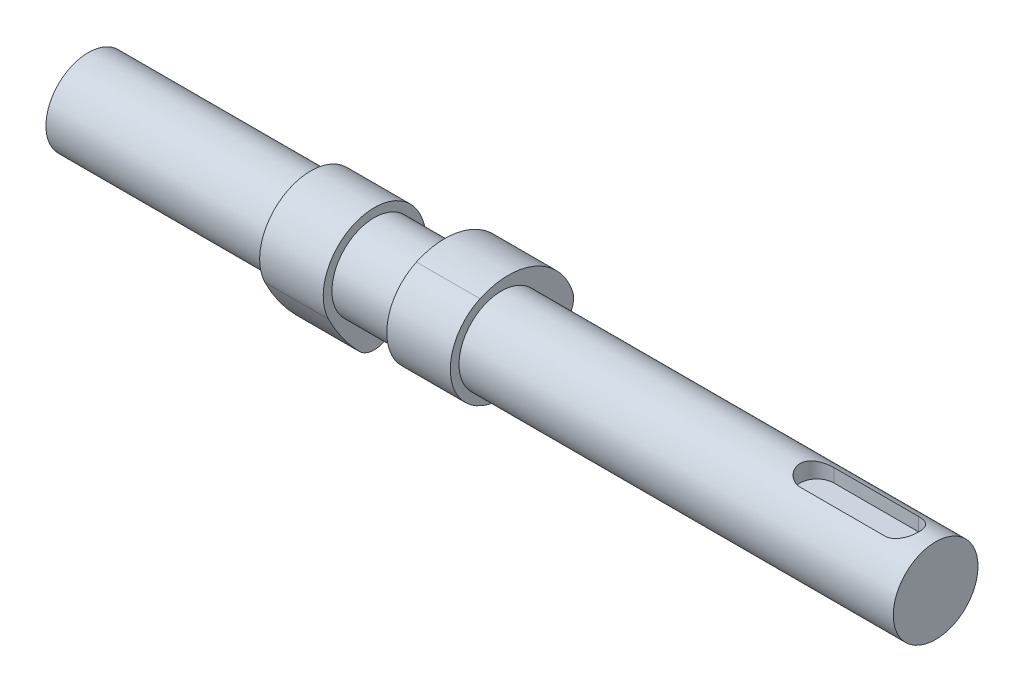
ISO-10303-21;
HEADER;
FILE_DESCRIPTION(('STEP AP214'),'2;1');
FILE_NAME('part.step','',(''),(''),'','','');
FILE_SCHEMA(('AUTOMOTIVE_DESIGN { 1 0 10303 214 1 1 1 1 }'));
ENDSEC;
DATA;
#1=APPLICATION_CONTEXT('core data for automotive mechanical design processes');
#2=APPLICATION_PROTOCOL_DEFINITION('international standard','automotive_design',2000,#1);
#3=PRODUCT_CONTEXT('',#1,'mechanical');
#4=PRODUCT('Part','Part','',(#3));
#5=PRODUCT_RELATED_PRODUCT_CATEGORY('part','',(#4));
#6=PRODUCT_DEFINITION_FORMATION('','',#4);
#7=PRODUCT_DEFINITION_CONTEXT('part definition',#1,'design');
#8=PRODUCT_DEFINITION('design','',#6,#7);
#9=PRODUCT_DEFINITION_SHAPE('','',#8);
#10=(LENGTH_UNIT() NAMED_UNIT(*) SI_UNIT(.MILLI.,.METRE.));
#11=(NAMED_UNIT(*) PLANE_ANGLE_UNIT() SI_UNIT($,.RADIAN.));
#12=(NAMED_UNIT(*) SI_UNIT($,.STERADIAN.) SOLID_ANGLE_UNIT());
#13=UNCERTAINTY_MEASURE_WITH_UNIT(LENGTH_MEASURE(1.E-05),#10,'distance_accuracy_value','');
#14=(GEOMETRIC_REPRESENTATION_CONTEXT(3) GLOBAL_UNCERTAINTY_ASSIGNED_CONTEXT((#13)) GLOBAL_UNIT_ASSIGNED_CONTEXT((#10,
#11,#12)) REPRESENTATION_CONTEXT('',''));
#15=CARTESIAN_POINT('',(0.,0.,0.));
#16=DIRECTION('',(0.,0.,1.));
#17=DIRECTION('',(1.,0.,0.));
#18=AXIS2_PLACEMENT_3D('',#15,#16,#17);
#19=CARTESIAN_POINT('',(-22.5,12.3905330358837,-25.0508071569189));
#20=DIRECTION('',(1.,0.,0.));
#21=DIRECTION('',(0.,1.,0.));
#22=AXIS2_PLACEMENT_3D('',#19,#20,#21);
#23=CYLINDRICAL_SURFACE('',#22,40.);
#24=CARTESIAN_POINT('',(-7.5,12.3905330358837,-25.0508071569189));
#25=DIRECTION('',(1.,0.,0.));
#26=DIRECTION('',(0.,-1.,0.));
#27=AXIS2_PLACEMENT_3D('',#24,#25,#26);
#28=CIRCLE('',#27,40.);
#29=CARTESIAN_POINT('',(-7.5,-5.34341737172486,10.8031605864213));
#30=VERTEX_POINT('',#29);
#31=CARTESIAN_POINT('',(-7.5,-15.5442495728118,3.57868673670275));
#32=VERTEX_POINT('',#31);
#33=EDGE_CURVE('E110',#30,#32,#28,.T.);
#34=ORIENTED_EDGE('',*,*,#33,.F.);
#35=DIRECTION('',(1.,0.,0.));
#36=VECTOR('',#35,1.);
#37=CARTESIAN_POINT('',(-22.5,-5.34341737172486,10.8031605864213));
#38=LINE('',#37,#36);
#39=CARTESIAN_POINT('',(-22.5,-5.34341737172486,10.8031605864213));
#40=VERTEX_POINT('',#39);
#41=EDGE_CURVE('E109',#40,#30,#38,.T.);
#42=ORIENTED_EDGE('',*,*,#41,.F.);
#43=CARTESIAN_POINT('',(-22.5,12.3905330358837,-25.0508071569189));
#44=DIRECTION('',(1.,0.,0.));
#45=DIRECTION('',(0.,-1.,0.));
#46=AXIS2_PLACEMENT_3D('',#43,#44,#45);
#47=CIRCLE('',#46,40.);
#48=CARTESIAN_POINT('',(-22.5,-15.5442495728118,3.57868673670275));
#49=VERTEX_POINT('',#48);
#50=EDGE_CURVE('E104',#40,#49,#47,.T.);
#51=ORIENTED_EDGE('',*,*,#50,.T.);
#52=DIRECTION('',(1.,0.,0.));
#53=VECTOR('',#52,1.);
#54=CARTESIAN_POINT('',(-22.5,-15.5442495728118,3.57868673670275));
#55=LINE('',#54,#53);
#56=EDGE_CURVE('E12',#49,#32,#55,.T.);
#57=ORIENTED_EDGE('',*,*,#56,.T.);
#58=EDGE_LOOP('',(#34,#42,#51,#57));
#59=FACE_BOUND('',#58,.T.);
#60=ADVANCED_FACE('F47',(#59),#23,.T.);
#61=CARTESIAN_POINT('',(-22.5,-12.0524017467249,0.));
#62=DIRECTION('',(1.,0.,0.));
#63=DIRECTION('',(0.,1.,0.));
#64=AXIS2_PLACEMENT_3D('',#61,#62,#63);
#65=CYLINDRICAL_SURFACE('',#64,4.99999999999999);
#66=CARTESIAN_POINT('',(-7.5,-12.0524017467249,0.));
#67=DIRECTION('',(1.,0.,0.));
#68=DIRECTION('',(0.,-1.,0.));
#69=AXIS2_PLACEMENT_3D('',#66,#67,#68);
#70=CIRCLE('',#69,4.99999999999999);
#71=CARTESIAN_POINT('',(-7.5,-16.7794274384245,-1.62948706960555));
#72=VERTEX_POINT('',#71);
#73=EDGE_CURVE('E112',#32,#72,#70,.T.);
#74=ORIENTED_EDGE('',*,*,#73,.F.);
#75=ORIENTED_EDGE('',*,*,#56,.F.);
#76=CARTESIAN_POINT('',(-22.5,-12.0524017467249,0.));
#77=DIRECTION('',(1.,0.,0.));
#78=DIRECTION('',(0.,-1.,0.));
#79=AXIS2_PLACEMENT_3D('',#76,#77,#78);
#80=CIRCLE('',#79,4.99999999999999);
#81=CARTESIAN_POINT('',(-22.5,-16.7794274384245,-1.62948706960555));
#82=VERTEX_POINT('',#81);
#83=EDGE_CURVE('E88',#49,#82,#80,.T.);
#84=ORIENTED_EDGE('',*,*,#83,.T.);
#85=DIRECTION('',(1.,0.,0.));
#86=VECTOR('',#85,1.);
#87=CARTESIAN_POINT('',(-22.5,-16.7794274384245,-1.62948706960555));
#88=LINE('',#87,#86);
#89=EDGE_CURVE('E55',#82,#72,#88,.T.);
#90=ORIENTED_EDGE('',*,*,#89,.T.);
#91=EDGE_LOOP('',(#74,#75,#84,#90));
#92=FACE_BOUND('',#91,.T.);
#93=ADVANCED_FACE('F102',(#92),#65,.T.);
#94=CARTESIAN_POINT('',(-22.5,-1.65294522498575,3.58487155313234));
#95=DIRECTION('',(1.,0.,0.));
#96=DIRECTION('',(0.,1.,0.));
#97=AXIS2_PLACEMENT_3D('',#94,#95,#96);
#98=CYLINDRICAL_SURFACE('',#97,16.);
#99=CARTESIAN_POINT('',(-7.5,-1.65294522498575,3.58487155313234));
#100=DIRECTION('',(1.,0.,0.));
#101=DIRECTION('',(0.,1.,0.));
#102=AXIS2_PLACEMENT_3D('',#99,#100,#101);
#103=CIRCLE('',#102,16.);
#104=CARTESIAN_POINT('',(-7.5,5.04660267805386,-10.9449618215102));
#105=VERTEX_POINT('',#104);
#106=EDGE_CURVE('E98',#72,#105,#103,.T.);
#107=ORIENTED_EDGE('',*,*,#106,.F.);
#108=ORIENTED_EDGE('',*,*,#89,.F.);
#109=CARTESIAN_POINT('',(-22.5,-1.65294522498575,3.58487155313234));
#110=DIRECTION('',(1.,0.,0.));
#111=DIRECTION('',(0.,1.,0.));
#112=AXIS2_PLACEMENT_3D('',#109,#110,#111);
#113=CIRCLE('',#112,16.);
#114=CARTESIAN_POINT('',(-22.5,5.04660267805386,-10.9449618215102));
#115=VERTEX_POINT('',#114);
#116=EDGE_CURVE('E91',#82,#115,#113,.T.);
#117=ORIENTED_EDGE('',*,*,#116,.T.);
#118=DIRECTION('',(1.,0.,0.));
#119=VECTOR('',#118,1.);
#120=CARTESIAN_POINT('',(-22.5,5.04660267805386,-10.9449618215102));
#121=LINE('',#120,#119);
#122=EDGE_CURVE('E101',#115,#105,#121,.T.);
#123=ORIENTED_EDGE('',*,*,#122,.T.);
#124=EDGE_LOOP('',(#107,#108,#117,#123));
#125=FACE_BOUND('',#124,.T.);
#126=ADVANCED_FACE('F97',(#125),#98,.T.);
#127=CARTESIAN_POINT('',(-22.5,0.,0.));
#128=DIRECTION('',(1.,0.,0.));
#129=DIRECTION('',(0.,1.,0.));
#130=AXIS2_PLACEMENT_3D('',#127,#128,#129);
#131=CYLINDRICAL_SURFACE('',#130,12.0524017467249);
#132=CARTESIAN_POINT('',(-7.5,0.,0.));
#133=DIRECTION('',(1.,0.,0.));
#134=DIRECTION('',(0.,-1.,0.));
#135=AXIS2_PLACEMENT_3D('',#132,#133,#134);
#136=CIRCLE('',#135,12.0524017467249);
#137=EDGE_CURVE('E77',#105,#30,#136,.T.);
#138=ORIENTED_EDGE('',*,*,#137,.F.);
#139=ORIENTED_EDGE('',*,*,#122,.F.);
#140=CARTESIAN_POINT('',(-22.5,0.,0.));
#141=DIRECTION('',(1.,0.,0.));
#142=DIRECTION('',(0.,-1.,0.));
#143=AXIS2_PLACEMENT_3D('',#140,#141,#142);
#144=CIRCLE('',#143,12.0524017467249);
#145=EDGE_CURVE('E63',#115,#40,#144,.T.);
#146=ORIENTED_EDGE('',*,*,#145,.T.);
#147=ORIENTED_EDGE('',*,*,#41,.T.);
#148=EDGE_LOOP('',(#138,#139,#146,#147));
#149=FACE_BOUND('',#148,.T.);
#150=ADVANCED_FACE('F121',(#149),#131,.T.);
#151=CARTESIAN_POINT('',(-22.5,0.169065644579419,-12.5254035784594));
#152=DIRECTION('',(-1.,0.,0.));
#153=DIRECTION('',(0.,-1.,0.));
#154=AXIS2_PLACEMENT_3D('',#151,#152,#153);
#155=PLANE('',#154);
#156=ORIENTED_EDGE('',*,*,#50,.F.);
#157=ORIENTED_EDGE('',*,*,#145,.F.);
#158=ORIENTED_EDGE('',*,*,#116,.F.);
#159=ORIENTED_EDGE('',*,*,#83,.F.);
#160=EDGE_LOOP('',(#156,#157,#158,#159));
#161=FACE_BOUND('',#160,.T.);
#162=ADVANCED_FACE('F93',(#161),#155,.T.);
#163=CARTESIAN_POINT('',(-7.5,0.169065644579419,-12.5254035784594));
#164=DIRECTION('',(-1.,0.,0.));
#165=DIRECTION('',(0.,-1.,0.));
#166=AXIS2_PLACEMENT_3D('',#163,#164,#165);
#167=PLANE('',#166);
#168=ORIENTED_EDGE('',*,*,#33,.T.);
#169=ORIENTED_EDGE('',*,*,#73,.T.);
#170=ORIENTED_EDGE('',*,*,#106,.T.);
#171=ORIENTED_EDGE('',*,*,#137,.T.);
#172=EDGE_LOOP('',(#168,#169,#170,#171));
#173=FACE_BOUND('',#172,.T.);
#174=ADVANCED_FACE('F117',(#173),#167,.F.);
#175=CLOSED_SHELL('',(#60,#93,#126,#150,#162,#174));
#176=MANIFOLD_SOLID_BREP('B2',#175);
#177=CARTESIAN_POINT('',(22.5,25.0508071569189,12.3905330358838));
#178=DIRECTION('',(-1.,0.,0.));
#179=DIRECTION('',(0.,0.,1.));
#180=AXIS2_PLACEMENT_3D('',#177,#178,#179);
#181=CYLINDRICAL_SURFACE('',#180,40.);
#182=CARTESIAN_POINT('',(7.5,25.0508071569189,12.3905330358838));
#183=DIRECTION('',(1.,0.,0.));
#184=DIRECTION('',(0.,0.,-1.));
#185=AXIS2_PLACEMENT_3D('',#182,#183,#184);
#186=CIRCLE('',#185,40.);
#187=CARTESIAN_POINT('',(7.5,-10.8031605864213,-5.3434173717249));
#188=VERTEX_POINT('',#187);
#189=CARTESIAN_POINT('',(7.5,-3.57868673670269,-15.5442495728119));
#190=VERTEX_POINT('',#189);
#191=EDGE_CURVE('E242',#188,#190,#186,.T.);
#192=ORIENTED_EDGE('',*,*,#191,.T.);
#193=DIRECTION('',(-1.,0.,0.));
#194=VECTOR('',#193,1.);
#195=CARTESIAN_POINT('',(22.5,-3.57868673670269,-15.5442495728119));
#196=LINE('',#195,#194);
#197=CARTESIAN_POINT('',(22.5,-3.57868673670269,-15.5442495728119));
#198=VERTEX_POINT('',#197);
#199=EDGE_CURVE('E45',#198,#190,#196,.T.);
#200=ORIENTED_EDGE('',*,*,#199,.F.);
#201=CARTESIAN_POINT('',(22.5,25.0508071569189,12.3905330358838));
#202=DIRECTION('',(1.,0.,0.));
#203=DIRECTION('',(0.,0.,-1.));
#204=AXIS2_PLACEMENT_3D('',#201,#202,#203);
#205=CIRCLE('',#204,40.);
#206=CARTESIAN_POINT('',(22.5,-10.8031605864213,-5.3434173717249));
#207=VERTEX_POINT('',#206);
#208=EDGE_CURVE('E230',#207,#198,#205,.T.);
#209=ORIENTED_EDGE('',*,*,#208,.F.);
#210=DIRECTION('',(-1.,0.,0.));
#211=VECTOR('',#210,1.);
#212=CARTESIAN_POINT('',(22.5,-10.8031605864213,-5.3434173717249));
#213=LINE('',#212,#211);
#214=EDGE_CURVE('E238',#207,#188,#213,.T.);
#215=ORIENTED_EDGE('',*,*,#214,.T.);
#216=EDGE_LOOP('',(#192,#200,#209,#215));
#217=FACE_BOUND('',#216,.T.);
#218=ADVANCED_FACE('F179',(#217),#181,.T.);
#219=CARTESIAN_POINT('',(22.5,0.,-12.0524017467249));
#220=DIRECTION('',(-1.,0.,0.));
#221=DIRECTION('',(0.,0.,1.));
#222=AXIS2_PLACEMENT_3D('',#219,#220,#221);
#223=CYLINDRICAL_SURFACE('',#222,4.99999999999999);
#224=CARTESIAN_POINT('',(7.5,0.,-12.0524017467249));
#225=DIRECTION('',(1.,0.,0.));
#226=DIRECTION('',(0.,0.,-1.));
#227=AXIS2_PLACEMENT_3D('',#224,#225,#226);
#228=CIRCLE('',#227,4.99999999999999);
#229=CARTESIAN_POINT('',(7.5,1.62948706960561,-16.7794274384245));
#230=VERTEX_POINT('',#229);
#231=EDGE_CURVE('E234',#190,#230,#228,.T.);
#232=ORIENTED_EDGE('',*,*,#231,.T.);
#233=DIRECTION('',(-1.,0.,0.));
#234=VECTOR('',#233,1.);
#235=CARTESIAN_POINT('',(22.5,1.62948706960561,-16.7794274384245));
#236=LINE('',#235,#234);
#237=CARTESIAN_POINT('',(22.5,1.62948706960561,-16.7794274384245));
#238=VERTEX_POINT('',#237);
#239=EDGE_CURVE('E187',#238,#230,#236,.T.);
#240=ORIENTED_EDGE('',*,*,#239,.F.);
#241=CARTESIAN_POINT('',(22.5,0.,-12.0524017467249));
#242=DIRECTION('',(1.,0.,0.));
#243=DIRECTION('',(0.,0.,-1.));
#244=AXIS2_PLACEMENT_3D('',#241,#242,#243);
#245=CIRCLE('',#244,4.99999999999999);
#246=EDGE_CURVE('E225',#198,#238,#245,.T.);
#247=ORIENTED_EDGE('',*,*,#246,.F.);
#248=ORIENTED_EDGE('',*,*,#199,.T.);
#249=EDGE_LOOP('',(#232,#240,#247,#248));
#250=FACE_BOUND('',#249,.T.);
#251=ADVANCED_FACE('F233',(#250),#223,.T.);
#252=CARTESIAN_POINT('',(22.5,-3.58487155313233,-1.65294522498577));
#253=DIRECTION('',(-1.,0.,0.));
#254=DIRECTION('',(0.,0.,1.));
#255=AXIS2_PLACEMENT_3D('',#252,#253,#254);
#256=CYLINDRICAL_SURFACE('',#255,16.);
#257=CARTESIAN_POINT('',(7.5,-3.58487155313233,-1.65294522498577));
#258=DIRECTION('',(1.,0.,0.));
#259=DIRECTION('',(0.,0.,1.));
#260=AXIS2_PLACEMENT_3D('',#257,#258,#259);
#261=CIRCLE('',#260,16.);
#262=CARTESIAN_POINT('',(7.5,10.9449618215102,5.0466026780539));
#263=VERTEX_POINT('',#262);
#264=EDGE_CURVE('E212',#230,#263,#261,.T.);
#265=ORIENTED_EDGE('',*,*,#264,.T.);
#266=DIRECTION('',(-1.,0.,0.));
#267=VECTOR('',#266,1.);
#268=CARTESIAN_POINT('',(22.5,10.9449618215102,5.0466026780539));
#269=LINE('',#268,#267);
#270=CARTESIAN_POINT('',(22.5,10.9449618215102,5.0466026780539));
#271=VERTEX_POINT('',#270);
#272=EDGE_CURVE('E235',#271,#263,#269,.T.);
#273=ORIENTED_EDGE('',*,*,#272,.F.);
#274=CARTESIAN_POINT('',(22.5,-3.58487155313233,-1.65294522498577));
#275=DIRECTION('',(1.,0.,0.));
#276=DIRECTION('',(0.,0.,1.));
#277=AXIS2_PLACEMENT_3D('',#274,#275,#276);
#278=CIRCLE('',#277,16.);
#279=EDGE_CURVE('E228',#238,#271,#278,.T.);
#280=ORIENTED_EDGE('',*,*,#279,.F.);
#281=ORIENTED_EDGE('',*,*,#239,.T.);
#282=EDGE_LOOP('',(#265,#273,#280,#281));
#283=FACE_BOUND('',#282,.T.);
#284=ADVANCED_FACE('F236',(#283),#256,.T.);
#285=CARTESIAN_POINT('',(22.5,0.,0.));
#286=DIRECTION('',(-1.,0.,0.));
#287=DIRECTION('',(0.,0.,1.));
#288=AXIS2_PLACEMENT_3D('',#285,#286,#287);
#289=CYLINDRICAL_SURFACE('',#288,12.0524017467249);
#290=CARTESIAN_POINT('',(7.5,0.,0.));
#291=DIRECTION('',(1.,0.,0.));
#292=DIRECTION('',(0.,0.,-1.));
#293=AXIS2_PLACEMENT_3D('',#290,#291,#292);
#294=CIRCLE('',#293,12.0524017467249);
#295=EDGE_CURVE('E218',#263,#188,#294,.T.);
#296=ORIENTED_EDGE('',*,*,#295,.T.);
#297=ORIENTED_EDGE('',*,*,#214,.F.);
#298=CARTESIAN_POINT('',(22.5,0.,0.));
#299=DIRECTION('',(1.,0.,0.));
#300=DIRECTION('',(0.,0.,-1.));
#301=AXIS2_PLACEMENT_3D('',#298,#299,#300);
#302=CIRCLE('',#301,12.0524017467249);
#303=EDGE_CURVE('E195',#271,#207,#302,.T.);
#304=ORIENTED_EDGE('',*,*,#303,.F.);
#305=ORIENTED_EDGE('',*,*,#272,.T.);
#306=EDGE_LOOP('',(#296,#297,#304,#305));
#307=FACE_BOUND('',#306,.T.);
#308=ADVANCED_FACE('F249',(#307),#289,.T.);
#309=CARTESIAN_POINT('',(22.5,12.5254035784594,0.169065644579463));
#310=DIRECTION('',(1.,0.,0.));
#311=DIRECTION('',(0.,0.,-1.));
#312=AXIS2_PLACEMENT_3D('',#309,#310,#311);
#313=PLANE('',#312);
#314=ORIENTED_EDGE('',*,*,#208,.T.);
#315=ORIENTED_EDGE('',*,*,#246,.T.);
#316=ORIENTED_EDGE('',*,*,#279,.T.);
#317=ORIENTED_EDGE('',*,*,#303,.T.);
#318=EDGE_LOOP('',(#314,#315,#316,#317));
#319=FACE_BOUND('',#318,.T.);
#320=ADVANCED_FACE('F226',(#319),#313,.T.);
#321=CARTESIAN_POINT('',(7.5,12.5254035784594,0.169065644579463));
#322=DIRECTION('',(1.,0.,0.));
#323=DIRECTION('',(0.,0.,-1.));
#324=AXIS2_PLACEMENT_3D('',#321,#322,#323);
#325=PLANE('',#324);
#326=ORIENTED_EDGE('',*,*,#191,.F.);
#327=ORIENTED_EDGE('',*,*,#295,.F.);
#328=ORIENTED_EDGE('',*,*,#264,.F.);
#329=ORIENTED_EDGE('',*,*,#231,.F.);
#330=EDGE_LOOP('',(#326,#327,#328,#329));
#331=FACE_BOUND('',#330,.T.);
#332=ADVANCED_FACE('F252',(#331),#325,.F.);
#333=CLOSED_SHELL('',(#218,#251,#284,#308,#320,#332));
#334=MANIFOLD_SOLID_BREP('B6',#333);
#335=CARTESIAN_POINT('',(125.,0.,0.));
#336=DIRECTION('',(-1.,0.,0.));
#337=DIRECTION('',(0.,0.,1.));
#338=AXIS2_PLACEMENT_3D('',#335,#336,#337);
#339=CYLINDRICAL_SURFACE('',#338,10.);
#340=DIRECTION('',(-1.,0.,0.));
#341=VECTOR('',#340,1.);
#342=CARTESIAN_POINT('',(125.,9.16515138991168,4.));
#343=LINE('',#342,#341);
#344=CARTESIAN_POINT('',(117.,9.16515138991168,4.));
#345=VERTEX_POINT('',#344);
#346=CARTESIAN_POINT('',(97.,9.16515138991168,4.00000000000001));
#347=VERTEX_POINT('',#346);
#348=EDGE_CURVE('E177',#345,#347,#343,.T.);
#349=ORIENTED_EDGE('',*,*,#348,.T.);
#350=CARTESIAN_POINT('',(97.,9.16515138991168,4.00000000000001));
#351=CARTESIAN_POINT('',(96.8923882949458,9.16512928809544,4.00001596071938));
#352=CARTESIAN_POINT('',(96.7847886688333,9.16704612011429,3.99565782731266));
#353=CARTESIAN_POINT('',(96.5704574034612,9.17459250745478,3.9783181194646));
#354=CARTESIAN_POINT('',(96.4637254492831,9.18022064873058,3.96533982937531));
#355=CARTESIAN_POINT('',(96.2523063568937,9.19499565865171,3.930952073529));
#356=CARTESIAN_POINT('',(96.1476128319149,9.20412861441611,3.90957593640917));
#357=CARTESIAN_POINT('',(95.9405984565681,9.22560106586818,3.85863260381273));
#358=CARTESIAN_POINT('',(95.8382777514449,9.23794075728509,3.82906490834148));
#359=CARTESIAN_POINT('',(95.5361282988375,9.2791858250141,3.72853943587112));
#360=CARTESIAN_POINT('',(95.3406915386172,9.3123489831615,3.64568978920222));
#361=CARTESIAN_POINT('',(94.9664088398381,9.38624741529469,3.45096383184147));
#362=CARTESIAN_POINT('',(94.7875788940914,9.42698987727426,3.33905992673094));
#363=CARTESIAN_POINT('',(94.441475206636,9.51401998804847,3.08263671474506));
#364=CARTESIAN_POINT('',(94.2752655660996,9.56048491272144,2.93673827988501));
#365=CARTESIAN_POINT('',(93.9689194556385,9.652255810962,2.61939292349378));
#366=CARTESIAN_POINT('',(93.8287883384928,9.69756154495612,2.44794076987998));
#367=CARTESIAN_POINT('',(93.5731872113755,9.78406834216145,2.07601181629753));
#368=CARTESIAN_POINT('',(93.4589103805898,9.82503649102096,1.87465586655101));
#369=CARTESIAN_POINT('',(93.2663118555086,9.89607888234979,1.45364828604451));
#370=CARTESIAN_POINT('',(93.1879751552067,9.92615767032248,1.2340043363753));
#371=CARTESIAN_POINT('',(93.0733175942291,9.97076629361036,0.79393488418736));
#372=CARTESIAN_POINT('',(93.0351460866968,9.98597845290695,0.574062114869011));
#373=CARTESIAN_POINT('',(92.9959430515965,10.001606202074,0.130536855092194));
#374=CARTESIAN_POINT('',(92.9948983667482,10.0020270338048,-0.0931142682526887));
#375=CARTESIAN_POINT('',(93.0289656379282,9.98843920775428,-0.524466731987242));
#376=CARTESIAN_POINT('',(93.0620499465532,9.97523973659777,-0.732358330632762));
#377=CARTESIAN_POINT('',(93.1599870009102,9.93698538393897,-1.1393496473869));
#378=CARTESIAN_POINT('',(93.2248415445704,9.91192983148495,-1.3384488672256));
#379=CARTESIAN_POINT('',(93.3852720377719,9.85193670608706,-1.7257947968835));
#380=CARTESIAN_POINT('',(93.4812963958391,9.81685584875391,-1.91383264586892));
#381=CARTESIAN_POINT('',(93.7009312637048,9.74029168639969,-2.27161599563071));
#382=CARTESIAN_POINT('',(93.8245514514379,9.69880613681324,-2.44135504792271));
#383=CARTESIAN_POINT('',(94.1052800574364,9.61043706268122,-2.76952257830691));
#384=CARTESIAN_POINT('',(94.2640530171164,9.56337795745419,-2.92647922614484));
#385=CARTESIAN_POINT('',(94.6059921366628,9.47123359153046,-3.21221470862621));
#386=CARTESIAN_POINT('',(94.7891693487996,9.42614923753061,-3.3409807059479));
#387=CARTESIAN_POINT('',(95.0816356456234,9.36326134539254,-3.5118613485139));
#388=CARTESIAN_POINT('',(95.1836718383149,9.34283170142194,-3.56571263251516));
#389=CARTESIAN_POINT('',(95.3923923024092,9.30450957703984,-3.6645476150566));
#390=CARTESIAN_POINT('',(95.4990745457273,9.28661600381593,-3.70953513634087));
#391=CARTESIAN_POINT('',(95.7162289304963,9.25400250539921,-3.79016254319008));
#392=CARTESIAN_POINT('',(95.8266961700414,9.2392786427695,-3.82581403809399));
#393=CARTESIAN_POINT('',(96.0506683681487,9.2135146773091,-3.88744848158464));
#394=CARTESIAN_POINT('',(96.1641719402126,9.20247292309662,-3.91343576505912));
#395=CARTESIAN_POINT('',(96.3974454473375,9.18417798205495,-3.95619393609846));
#396=CARTESIAN_POINT('',(96.5172941945639,9.17707470750587,-3.9726012558417));
#397=CARTESIAN_POINT('',(96.7580909291371,9.16754485606458,-3.99451448409732));
#398=CARTESIAN_POINT('',(96.8790381929227,9.16511539745838,-4.0000271099601));
#399=CARTESIAN_POINT('',(97.,9.16515138991168,-4.));
#400=B_SPLINE_CURVE_WITH_KNOTS('',3,(#350,#351,#352,#353,#354,#355,#356,#357,#358,#359,#360,
#361,#362,#363,#364,#365,#366,#367,#368,#369,#370,#371,#372,#373,#374,#375,#376,#377,#378,#379,
#380,#381,#382,#383,#384,#385,#386,#387,#388,#389,#390,#391,#392,#393,#394,#395,#396,#397,#398,
#399),.UNSPECIFIED.,.F.,.F.,(4,2,2,2,2,2,2,2,2,2,2,2,2,2,2,2,2,2,2,2,2,2,2,2,4),(0.,
0.322709706217834,0.645296527806424,0.966615822543774,1.28795473422463,1.9293660035182,
2.57138869889252,3.24636095994996,3.92147161082383,4.62325717855529,5.32474946398647,
5.99227753012541,6.65956903033313,7.28937830523072,7.9192232261531,8.55856353859095,
9.1981284227004,9.87963749353247,10.5614562641081,10.9125878460839,11.2635676597188,
11.614108935291,11.964492785171,12.3274303244848,12.6901440171997),.UNSPECIFIED.);
#401=CARTESIAN_POINT('',(97.,9.16515138991168,-4.));
#402=VERTEX_POINT('',#401);
#403=EDGE_CURVE('E378',#347,#402,#400,.T.);
#404=ORIENTED_EDGE('',*,*,#403,.T.);
#405=DIRECTION('',(-1.,0.,0.));
#406=VECTOR('',#405,1.);
#407=CARTESIAN_POINT('',(125.,9.16515138991168,-4.));
#408=LINE('',#407,#406);
#409=CARTESIAN_POINT('',(117.,9.16515138991168,-4.));
#410=VERTEX_POINT('',#409);
#411=EDGE_CURVE('E311',#402,#410,#408,.F.);
#412=ORIENTED_EDGE('',*,*,#411,.T.);
#413=CARTESIAN_POINT('',(117.,9.16515138991168,-4.));
#414=CARTESIAN_POINT('',(117.107611705054,9.16512928809544,-4.00001596071937));
#415=CARTESIAN_POINT('',(117.215211331167,9.16704612011429,-3.99565782731265));
#416=CARTESIAN_POINT('',(117.429542596539,9.17459250745478,-3.97831811946459));
#417=CARTESIAN_POINT('',(117.536274550717,9.18022064873058,-3.96533982937531));
#418=CARTESIAN_POINT('',(117.747693643106,9.19499565865172,-3.93095207352899));
#419=CARTESIAN_POINT('',(117.852387168085,9.20412861441611,-3.90957593640916));
#420=CARTESIAN_POINT('',(118.059401543432,9.22560106586819,-3.85863260381272));
#421=CARTESIAN_POINT('',(118.161722248555,9.23794075728509,-3.82906490834147));
#422=CARTESIAN_POINT('',(118.463871701162,9.2791858250141,-3.72853943587111));
#423=CARTESIAN_POINT('',(118.659308461383,9.3123489831615,-3.64568978920221));
#424=CARTESIAN_POINT('',(119.033591160162,9.3862474152947,-3.45096383184147));
#425=CARTESIAN_POINT('',(119.212421105909,9.42698987727426,-3.33905992673094));
#426=CARTESIAN_POINT('',(119.558524793364,9.51401998804847,-3.08263671474506));
#427=CARTESIAN_POINT('',(119.7247344339,9.56048491272145,-2.936738279885));
#428=CARTESIAN_POINT('',(120.031080544362,9.652255810962,-2.61939292349377));
#429=CARTESIAN_POINT('',(120.171211661507,9.69756154495613,-2.44794076987997));
#430=CARTESIAN_POINT('',(120.426812788624,9.78406834216145,-2.07601181629752));
#431=CARTESIAN_POINT('',(120.54108961941,9.82503649102096,-1.87465586655101));
#432=CARTESIAN_POINT('',(120.733688144491,9.8960788823498,-1.45364828604451));
#433=CARTESIAN_POINT('',(120.812024844793,9.92615767032248,-1.23400433637529));
#434=CARTESIAN_POINT('',(120.926682405771,9.97076629361036,-0.793934884187353));
#435=CARTESIAN_POINT('',(120.964853913303,9.98597845290695,-0.574062114869004));
#436=CARTESIAN_POINT('',(121.004056948403,10.001606202074,-0.130536855092188));
#437=CARTESIAN_POINT('',(121.005101633252,10.0020270338048,0.0931142682526946));
#438=CARTESIAN_POINT('',(120.971034362072,9.98843920775428,0.524466731987248));
#439=CARTESIAN_POINT('',(120.937950053447,9.97523973659777,0.732358330632769));
#440=CARTESIAN_POINT('',(120.84001299909,9.93698538393897,1.1393496473869));
#441=CARTESIAN_POINT('',(120.77515845543,9.91192983148495,1.3384488672256));
#442=CARTESIAN_POINT('',(120.614727962228,9.85193670608706,1.7257947968835));
#443=CARTESIAN_POINT('',(120.518703604161,9.81685584875391,1.91383264586893));
#444=CARTESIAN_POINT('',(120.299068736295,9.74029168639969,2.27161599563072));
#445=CARTESIAN_POINT('',(120.175448548562,9.69880613681324,2.44135504792272));
#446=CARTESIAN_POINT('',(119.894719942564,9.61043706268122,2.76952257830692));
#447=CARTESIAN_POINT('',(119.735946982884,9.56337795745419,2.92647922614484));
#448=CARTESIAN_POINT('',(119.394007863337,9.47123359153046,3.21221470862621));
#449=CARTESIAN_POINT('',(119.2108306512,9.42614923753061,3.3409807059479));
#450=CARTESIAN_POINT('',(118.918364354377,9.36326134539254,3.5118613485139));
#451=CARTESIAN_POINT('',(118.816328161685,9.34283170142194,3.56571263251516));
#452=CARTESIAN_POINT('',(118.607607697591,9.30450957703985,3.6645476150566));
#453=CARTESIAN_POINT('',(118.500925454273,9.28661600381593,3.70953513634087));
#454=CARTESIAN_POINT('',(118.283771069504,9.2540025053992,3.79016254319008));
#455=CARTESIAN_POINT('',(118.173303829959,9.2392786427695,3.82581403809399));
#456=CARTESIAN_POINT('',(117.949331631851,9.2135146773091,3.88744848158464));
#457=CARTESIAN_POINT('',(117.835828059787,9.20247292309662,3.91343576505912));
#458=CARTESIAN_POINT('',(117.602554552662,9.18417798205495,3.95619393609846));
#459=CARTESIAN_POINT('',(117.482705805436,9.17707470750587,3.9726012558417));
#460=CARTESIAN_POINT('',(117.241909070863,9.16754485606458,3.99451448409732));
#461=CARTESIAN_POINT('',(117.120961807077,9.16511539745838,4.00002710996011));
#462=CARTESIAN_POINT('',(117.,9.16515138991168,4.));
#463=B_SPLINE_CURVE_WITH_KNOTS('',3,(#413,#414,#415,#416,#417,#418,#419,#420,#421,#422,#423,
#424,#425,#426,#427,#428,#429,#430,#431,#432,#433,#434,#435,#436,#437,#438,#439,#440,#441,#442,
#443,#444,#445,#446,#447,#448,#449,#450,#451,#452,#453,#454,#455,#456,#457,#458,#459,#460,#461,
#462),.UNSPECIFIED.,.F.,.F.,(4,2,2,2,2,2,2,2,2,2,2,2,2,2,2,2,2,2,2,2,2,2,2,2,4),(0.,
0.322709706217848,0.645296527806438,0.966615822543788,1.28795473422463,1.9293660035182,
2.57138869889252,3.24636095994998,3.92147161082383,4.62325717855529,5.32474946398647,
5.99227753012542,6.65956903033313,7.28937830523072,7.9192232261531,8.55856353859096,
9.19812842270039,9.87963749353246,10.5614562641081,10.9125878460839,11.2635676597188,
11.614108935291,11.964492785171,12.3274303244848,12.6901440171997),.UNSPECIFIED.);
#464=EDGE_CURVE('E318',#410,#345,#463,.T.);
#465=ORIENTED_EDGE('',*,*,#464,.T.);
#466=EDGE_LOOP('',(#349,#404,#412,#465));
#467=FACE_BOUND('',#466,.T.);
#468=CARTESIAN_POINT('',(125.,0.,0.));
#469=DIRECTION('',(1.,0.,0.));
#470=DIRECTION('',(0.,0.,-1.));
#471=AXIS2_PLACEMENT_3D('',#468,#469,#470);
#472=CIRCLE('',#471,10.);
#473=CARTESIAN_POINT('',(125.,0.,-10.));
#474=VERTEX_POINT('',#473);
#475=EDGE_CURVE('E375',#474,#474,#472,.T.);
#476=ORIENTED_EDGE('',*,*,#475,.F.);
#477=EDGE_LOOP('',(#476));
#478=FACE_BOUND('',#477,.T.);
#479=CARTESIAN_POINT('',(-75.,0.,0.));
#480=DIRECTION('',(1.,0.,0.));
#481=DIRECTION('',(0.,0.,-1.));
#482=AXIS2_PLACEMENT_3D('',#479,#480,#481);
#483=CIRCLE('',#482,10.);
#484=CARTESIAN_POINT('',(-75.,0.,-10.));
#485=VERTEX_POINT('',#484);
#486=EDGE_CURVE('E369',#485,#485,#483,.T.);
#487=ORIENTED_EDGE('',*,*,#486,.T.);
#488=EDGE_LOOP('',(#487));
#489=FACE_BOUND('',#488,.T.);
#490=ADVANCED_FACE('F303',(#467,#478,#489),#339,.T.);
#491=CARTESIAN_POINT('',(125.,0.,0.));
#492=DIRECTION('',(1.,0.,0.));
#493=DIRECTION('',(0.,0.,-1.));
#494=AXIS2_PLACEMENT_3D('',#491,#492,#493);
#495=PLANE('',#494);
#496=ORIENTED_EDGE('',*,*,#475,.T.);
#497=EDGE_LOOP('',(#496));
#498=FACE_BOUND('',#497,.T.);
#499=ADVANCED_FACE('F405',(#498),#495,.T.);
#500=CARTESIAN_POINT('',(-75.,0.,0.));
#501=DIRECTION('',(1.,0.,0.));
#502=DIRECTION('',(0.,0.,-1.));
#503=AXIS2_PLACEMENT_3D('',#500,#501,#502);
#504=PLANE('',#503);
#505=ORIENTED_EDGE('',*,*,#486,.F.);
#506=EDGE_LOOP('',(#505));
#507=FACE_BOUND('',#506,.T.);
#508=ADVANCED_FACE('F403',(#507),#504,.F.);
#509=CARTESIAN_POINT('',(117.,6.,0.));
#510=DIRECTION('',(0.,1.,0.));
#511=DIRECTION('',(0.,0.,1.));
#512=AXIS2_PLACEMENT_3D('',#509,#510,#511);
#513=CYLINDRICAL_SURFACE('',#512,4.);
#514=DIRECTION('',(0.,1.,0.));
#515=VECTOR('',#514,1.);
#516=CARTESIAN_POINT('',(117.,6.,-4.));
#517=LINE('',#516,#515);
#518=CARTESIAN_POINT('',(117.,6.,-4.));
#519=VERTEX_POINT('',#518);
#520=EDGE_CURVE('E341',#519,#410,#517,.T.);
#521=ORIENTED_EDGE('',*,*,#520,.F.);
#522=CARTESIAN_POINT('',(117.,6.,0.));
#523=DIRECTION('',(0.,1.,0.));
#524=DIRECTION('',(0.,0.,1.));
#525=AXIS2_PLACEMENT_3D('',#522,#523,#524);
#526=CIRCLE('',#525,4.);
#527=CARTESIAN_POINT('',(117.,6.,4.));
#528=VERTEX_POINT('',#527);
#529=EDGE_CURVE('E345',#528,#519,#526,.T.);
#530=ORIENTED_EDGE('',*,*,#529,.F.);
#531=DIRECTION('',(0.,1.,0.));
#532=VECTOR('',#531,1.);
#533=CARTESIAN_POINT('',(117.,6.,4.));
#534=LINE('',#533,#532);
#535=EDGE_CURVE('E367',#528,#345,#534,.T.);
#536=ORIENTED_EDGE('',*,*,#535,.T.);
#537=ORIENTED_EDGE('',*,*,#464,.F.);
#538=EDGE_LOOP('',(#521,#530,#536,#537));
#539=FACE_BOUND('',#538,.T.);
#540=ADVANCED_FACE('F343',(#539),#513,.F.);
#541=CARTESIAN_POINT('',(117.,6.,4.));
#542=DIRECTION('',(0.,0.,1.));
#543=DIRECTION('',(1.,0.,0.));
#544=AXIS2_PLACEMENT_3D('',#541,#542,#543);
#545=PLANE('',#544);
#546=ORIENTED_EDGE('',*,*,#535,.F.);
#547=DIRECTION('',(1.,0.,0.));
#548=VECTOR('',#547,1.);
#549=CARTESIAN_POINT('',(117.,6.,4.));
#550=LINE('',#549,#548);
#551=CARTESIAN_POINT('',(97.,6.,4.00000000000001));
#552=VERTEX_POINT('',#551);
#553=EDGE_CURVE('E350',#552,#528,#550,.T.);
#554=ORIENTED_EDGE('',*,*,#553,.F.);
#555=DIRECTION('',(0.,1.,0.));
#556=VECTOR('',#555,1.);
#557=CARTESIAN_POINT('',(97.,6.,4.00000000000001));
#558=LINE('',#557,#556);
#559=EDGE_CURVE('E370',#552,#347,#558,.T.);
#560=ORIENTED_EDGE('',*,*,#559,.T.);
#561=ORIENTED_EDGE('',*,*,#348,.F.);
#562=EDGE_LOOP('',(#546,#554,#560,#561));
#563=FACE_BOUND('',#562,.T.);
#564=ADVANCED_FACE('F396',(#563),#545,.F.);
#565=CARTESIAN_POINT('',(97.,6.,0.));
#566=DIRECTION('',(0.,1.,0.));
#567=DIRECTION('',(0.,0.,1.));
#568=AXIS2_PLACEMENT_3D('',#565,#566,#567);
#569=CYLINDRICAL_SURFACE('',#568,4.);
#570=ORIENTED_EDGE('',*,*,#559,.F.);
#571=CARTESIAN_POINT('',(97.,6.,0.));
#572=DIRECTION('',(0.,1.,0.));
#573=DIRECTION('',(0.,0.,1.));
#574=AXIS2_PLACEMENT_3D('',#571,#572,#573);
#575=CIRCLE('',#574,4.);
#576=CARTESIAN_POINT('',(97.,6.,-4.));
#577=VERTEX_POINT('',#576);
#578=EDGE_CURVE('E359',#577,#552,#575,.T.);
#579=ORIENTED_EDGE('',*,*,#578,.F.);
#580=DIRECTION('',(0.,1.,0.));
#581=VECTOR('',#580,1.);
#582=CARTESIAN_POINT('',(97.,6.,-4.));
#583=LINE('',#582,#581);
#584=EDGE_CURVE('E349',#577,#402,#583,.T.);
#585=ORIENTED_EDGE('',*,*,#584,.T.);
#586=ORIENTED_EDGE('',*,*,#403,.F.);
#587=EDGE_LOOP('',(#570,#579,#585,#586));
#588=FACE_BOUND('',#587,.T.);
#589=ADVANCED_FACE('F391',(#588),#569,.F.);
#590=CARTESIAN_POINT('',(117.,6.,-4.));
#591=DIRECTION('',(0.,0.,-1.));
#592=DIRECTION('',(-1.,0.,0.));
#593=AXIS2_PLACEMENT_3D('',#590,#591,#592);
#594=PLANE('',#593);
#595=ORIENTED_EDGE('',*,*,#584,.F.);
#596=DIRECTION('',(-1.,0.,0.));
#597=VECTOR('',#596,1.);
#598=CARTESIAN_POINT('',(117.,6.,-4.));
#599=LINE('',#598,#597);
#600=EDGE_CURVE('E353',#519,#577,#599,.T.);
#601=ORIENTED_EDGE('',*,*,#600,.F.);
#602=ORIENTED_EDGE('',*,*,#520,.T.);
#603=ORIENTED_EDGE('',*,*,#411,.F.);
#604=EDGE_LOOP('',(#595,#601,#602,#603));
#605=FACE_BOUND('',#604,.T.);
#606=ADVANCED_FACE('F354',(#605),#594,.F.);
#607=CARTESIAN_POINT('',(117.,6.,0.));
#608=DIRECTION('',(0.,1.,0.));
#609=DIRECTION('',(0.,0.,1.));
#610=AXIS2_PLACEMENT_3D('',#607,#608,#609);
#611=PLANE('',#610);
#612=ORIENTED_EDGE('',*,*,#529,.T.);
#613=ORIENTED_EDGE('',*,*,#600,.T.);
#614=ORIENTED_EDGE('',*,*,#578,.T.);
#615=ORIENTED_EDGE('',*,*,#553,.T.);
#616=EDGE_LOOP('',(#612,#613,#614,#615));
#617=FACE_BOUND('',#616,.T.);
#618=ADVANCED_FACE('F361',(#617),#611,.T.);
#619=CLOSED_SHELL('',(#490,#499,#508,#540,#564,#589,#606,#618));
#620=MANIFOLD_SOLID_BREP('B39',#619);
#621=ADVANCED_BREP_SHAPE_REPRESENTATION('',(#18,#176,#334,#620),#14);
#622=SHAPE_DEFINITION_REPRESENTATION(#9,#621);
ENDSEC;
END-ISO-10303-21;
